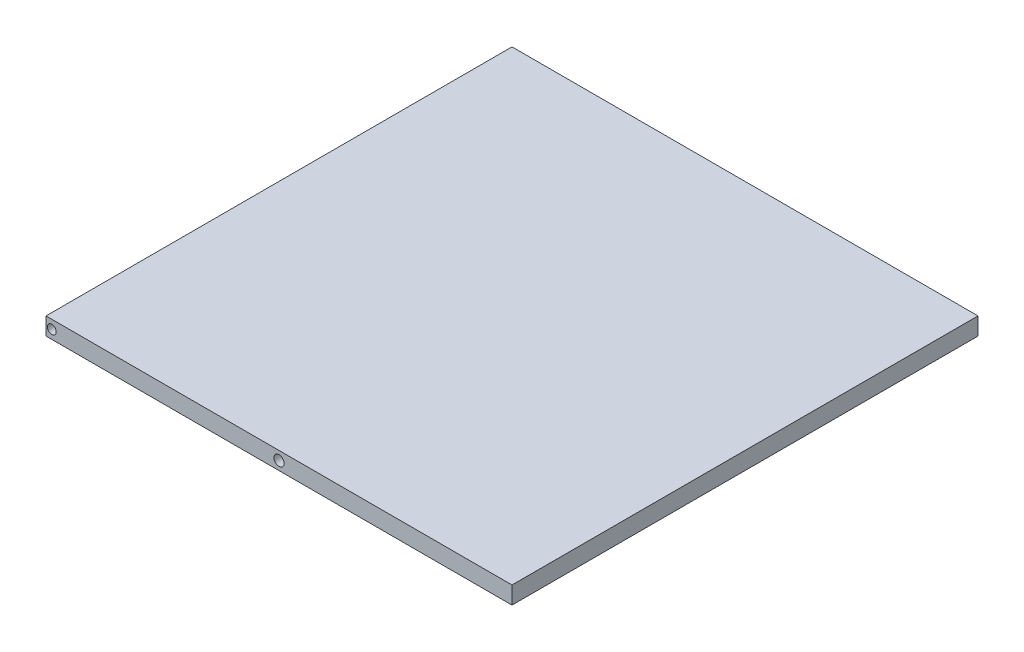
ISO-10303-21;
HEADER;
FILE_DESCRIPTION(('STEP AP214'),'2;1');
FILE_NAME('part.step','',(''),(''),'','','');
FILE_SCHEMA(('AUTOMOTIVE_DESIGN { 1 0 10303 214 1 1 1 1 }'));
ENDSEC;
DATA;
#1=APPLICATION_CONTEXT('core data for automotive mechanical design processes');
#2=APPLICATION_PROTOCOL_DEFINITION('international standard','automotive_design',2000,#1);
#3=PRODUCT_CONTEXT('',#1,'mechanical');
#4=PRODUCT('Part','Part','',(#3));
#5=PRODUCT_RELATED_PRODUCT_CATEGORY('part','',(#4));
#6=PRODUCT_DEFINITION_FORMATION('','',#4);
#7=PRODUCT_DEFINITION_CONTEXT('part definition',#1,'design');
#8=PRODUCT_DEFINITION('design','',#6,#7);
#9=PRODUCT_DEFINITION_SHAPE('','',#8);
#10=(LENGTH_UNIT() NAMED_UNIT(*) SI_UNIT(.MILLI.,.METRE.));
#11=(NAMED_UNIT(*) PLANE_ANGLE_UNIT() SI_UNIT($,.RADIAN.));
#12=(NAMED_UNIT(*) SI_UNIT($,.STERADIAN.) SOLID_ANGLE_UNIT());
#13=UNCERTAINTY_MEASURE_WITH_UNIT(LENGTH_MEASURE(1.E-05),#10,'distance_accuracy_value','');
#14=(GEOMETRIC_REPRESENTATION_CONTEXT(3) GLOBAL_UNCERTAINTY_ASSIGNED_CONTEXT((#13)) GLOBAL_UNIT_ASSIGNED_CONTEXT((#10,
#11,#12)) REPRESENTATION_CONTEXT('',''));
#15=CARTESIAN_POINT('',(0.,0.,0.));
#16=DIRECTION('',(0.,0.,1.));
#17=DIRECTION('',(1.,0.,0.));
#18=AXIS2_PLACEMENT_3D('',#15,#16,#17);
#19=CARTESIAN_POINT('',(0.,19.05,0.));
#20=DIRECTION('',(-1.,0.,0.));
#21=DIRECTION('',(0.,0.,1.));
#22=AXIS2_PLACEMENT_3D('',#19,#20,#21);
#23=PLANE('',#22);
#24=DIRECTION('',(0.,0.,-1.));
#25=VECTOR('',#24,1.);
#26=CARTESIAN_POINT('',(0.,0.,0.));
#27=LINE('',#26,#25);
#28=CARTESIAN_POINT('',(0.,0.,0.));
#29=VERTEX_POINT('',#28);
#30=CARTESIAN_POINT('',(0.,0.,-508.));
#31=VERTEX_POINT('',#30);
#32=EDGE_CURVE('E96',#29,#31,#27,.T.);
#33=ORIENTED_EDGE('',*,*,#32,.T.);
#34=DIRECTION('',(0.,-1.,0.));
#35=VECTOR('',#34,1.);
#36=CARTESIAN_POINT('',(0.,19.05,-508.));
#37=LINE('',#36,#35);
#38=CARTESIAN_POINT('',(0.,19.05,-508.));
#39=VERTEX_POINT('',#38);
#40=EDGE_CURVE('E11',#39,#31,#37,.T.);
#41=ORIENTED_EDGE('',*,*,#40,.F.);
#42=DIRECTION('',(0.,0.,-1.));
#43=VECTOR('',#42,1.);
#44=CARTESIAN_POINT('',(0.,19.05,0.));
#45=LINE('',#44,#43);
#46=CARTESIAN_POINT('',(0.,19.05,0.));
#47=VERTEX_POINT('',#46);
#48=EDGE_CURVE('E82',#47,#39,#45,.T.);
#49=ORIENTED_EDGE('',*,*,#48,.F.);
#50=DIRECTION('',(0.,-1.,0.));
#51=VECTOR('',#50,1.);
#52=CARTESIAN_POINT('',(0.,19.05,0.));
#53=LINE('',#52,#51);
#54=EDGE_CURVE('E49',#47,#29,#53,.T.);
#55=ORIENTED_EDGE('',*,*,#54,.T.);
#56=EDGE_LOOP('',(#33,#41,#49,#55));
#57=FACE_BOUND('',#56,.T.);
#58=ADVANCED_FACE('F33',(#57),#23,.F.);
#59=CARTESIAN_POINT('',(0.,19.05,-508.));
#60=DIRECTION('',(0.,0.,1.));
#61=DIRECTION('',(1.,0.,0.));
#62=AXIS2_PLACEMENT_3D('',#59,#60,#61);
#63=PLANE('',#62);
#64=CARTESIAN_POINT('',(-254.,9.525,-508.));
#65=DIRECTION('',(0.,0.,1.));
#66=DIRECTION('',(1.,0.,0.));
#67=AXIS2_PLACEMENT_3D('',#64,#65,#66);
#68=CIRCLE('',#67,5.52386460643103);
#69=CARTESIAN_POINT('',(-248.476135393569,9.525,-508.));
#70=VERTEX_POINT('',#69);
#71=EDGE_CURVE('E98',#70,#70,#68,.T.);
#72=ORIENTED_EDGE('',*,*,#71,.T.);
#73=EDGE_LOOP('',(#72));
#74=FACE_BOUND('',#73,.T.);
#75=CARTESIAN_POINT('',(-501.65,9.525,-508.));
#76=DIRECTION('',(0.,0.,1.));
#77=DIRECTION('',(1.,0.,0.));
#78=AXIS2_PLACEMENT_3D('',#75,#76,#77);
#79=CIRCLE('',#78,4.82599999999999);
#80=CARTESIAN_POINT('',(-496.824,9.525,-508.));
#81=VERTEX_POINT('',#80);
#82=EDGE_CURVE('E111',#81,#81,#79,.T.);
#83=ORIENTED_EDGE('',*,*,#82,.T.);
#84=EDGE_LOOP('',(#83));
#85=FACE_BOUND('',#84,.T.);
#86=DIRECTION('',(-1.,0.,0.));
#87=VECTOR('',#86,1.);
#88=CARTESIAN_POINT('',(0.,0.,-508.));
#89=LINE('',#88,#87);
#90=CARTESIAN_POINT('',(-508.,0.,-508.));
#91=VERTEX_POINT('',#90);
#92=EDGE_CURVE('E87',#31,#91,#89,.T.);
#93=ORIENTED_EDGE('',*,*,#92,.T.);
#94=DIRECTION('',(0.,-1.,0.));
#95=VECTOR('',#94,1.);
#96=CARTESIAN_POINT('',(-508.,19.05,-508.));
#97=LINE('',#96,#95);
#98=CARTESIAN_POINT('',(-508.,19.05,-508.));
#99=VERTEX_POINT('',#98);
#100=EDGE_CURVE('E41',#99,#91,#97,.T.);
#101=ORIENTED_EDGE('',*,*,#100,.F.);
#102=DIRECTION('',(-1.,0.,0.));
#103=VECTOR('',#102,1.);
#104=CARTESIAN_POINT('',(0.,19.05,-508.));
#105=LINE('',#104,#103);
#106=EDGE_CURVE('E74',#39,#99,#105,.T.);
#107=ORIENTED_EDGE('',*,*,#106,.F.);
#108=ORIENTED_EDGE('',*,*,#40,.T.);
#109=EDGE_LOOP('',(#93,#101,#107,#108));
#110=FACE_BOUND('',#109,.T.);
#111=ADVANCED_FACE('F86',(#74,#85,#110),#63,.F.);
#112=CARTESIAN_POINT('',(-508.,19.05,0.));
#113=DIRECTION('',(-1.,0.,0.));
#114=DIRECTION('',(0.,0.,1.));
#115=AXIS2_PLACEMENT_3D('',#112,#113,#114);
#116=PLANE('',#115);
#117=DIRECTION('',(0.,0.,-1.));
#118=VECTOR('',#117,1.);
#119=CARTESIAN_POINT('',(-508.,0.,0.));
#120=LINE('',#119,#118);
#121=CARTESIAN_POINT('',(-508.,0.,0.));
#122=VERTEX_POINT('',#121);
#123=EDGE_CURVE('E100',#122,#91,#120,.T.);
#124=ORIENTED_EDGE('',*,*,#123,.F.);
#125=DIRECTION('',(0.,-1.,0.));
#126=VECTOR('',#125,1.);
#127=CARTESIAN_POINT('',(-508.,19.05,0.));
#128=LINE('',#127,#126);
#129=CARTESIAN_POINT('',(-508.,19.05,0.));
#130=VERTEX_POINT('',#129);
#131=EDGE_CURVE('E63',#130,#122,#128,.T.);
#132=ORIENTED_EDGE('',*,*,#131,.F.);
#133=DIRECTION('',(0.,0.,-1.));
#134=VECTOR('',#133,1.);
#135=CARTESIAN_POINT('',(-508.,19.05,0.));
#136=LINE('',#135,#134);
#137=EDGE_CURVE('E81',#130,#99,#136,.T.);
#138=ORIENTED_EDGE('',*,*,#137,.T.);
#139=ORIENTED_EDGE('',*,*,#100,.T.);
#140=EDGE_LOOP('',(#124,#132,#138,#139));
#141=FACE_BOUND('',#140,.T.);
#142=ADVANCED_FACE('F90',(#141),#116,.T.);
#143=CARTESIAN_POINT('',(0.,19.05,0.));
#144=DIRECTION('',(0.,0.,1.));
#145=DIRECTION('',(1.,0.,0.));
#146=AXIS2_PLACEMENT_3D('',#143,#144,#145);
#147=PLANE('',#146);
#148=CARTESIAN_POINT('',(-254.,9.525,0.));
#149=DIRECTION('',(0.,0.,1.));
#150=DIRECTION('',(1.,0.,0.));
#151=AXIS2_PLACEMENT_3D('',#148,#149,#150);
#152=CIRCLE('',#151,5.52386460643103);
#153=CARTESIAN_POINT('',(-248.476135393569,9.525,0.));
#154=VERTEX_POINT('',#153);
#155=EDGE_CURVE('E114',#154,#154,#152,.T.);
#156=ORIENTED_EDGE('',*,*,#155,.F.);
#157=EDGE_LOOP('',(#156));
#158=FACE_BOUND('',#157,.T.);
#159=CARTESIAN_POINT('',(-501.65,9.525,0.));
#160=DIRECTION('',(0.,0.,1.));
#161=DIRECTION('',(1.,0.,0.));
#162=AXIS2_PLACEMENT_3D('',#159,#160,#161);
#163=CIRCLE('',#162,4.82599999999999);
#164=CARTESIAN_POINT('',(-496.824,9.525,0.));
#165=VERTEX_POINT('',#164);
#166=EDGE_CURVE('E108',#165,#165,#163,.T.);
#167=ORIENTED_EDGE('',*,*,#166,.F.);
#168=EDGE_LOOP('',(#167));
#169=FACE_BOUND('',#168,.T.);
#170=DIRECTION('',(-1.,0.,0.));
#171=VECTOR('',#170,1.);
#172=CARTESIAN_POINT('',(0.,0.,0.));
#173=LINE('',#172,#171);
#174=EDGE_CURVE('E102',#29,#122,#173,.T.);
#175=ORIENTED_EDGE('',*,*,#174,.F.);
#176=ORIENTED_EDGE('',*,*,#54,.F.);
#177=DIRECTION('',(-1.,0.,0.));
#178=VECTOR('',#177,1.);
#179=CARTESIAN_POINT('',(0.,19.05,0.));
#180=LINE('',#179,#178);
#181=EDGE_CURVE('E91',#47,#130,#180,.T.);
#182=ORIENTED_EDGE('',*,*,#181,.T.);
#183=ORIENTED_EDGE('',*,*,#131,.T.);
#184=EDGE_LOOP('',(#175,#176,#182,#183));
#185=FACE_BOUND('',#184,.T.);
#186=ADVANCED_FACE('F129',(#158,#169,#185),#147,.T.);
#187=CARTESIAN_POINT('',(0.,19.05,0.));
#188=DIRECTION('',(0.,1.,0.));
#189=DIRECTION('',(0.,0.,1.));
#190=AXIS2_PLACEMENT_3D('',#187,#188,#189);
#191=PLANE('',#190);
#192=ORIENTED_EDGE('',*,*,#48,.T.);
#193=ORIENTED_EDGE('',*,*,#106,.T.);
#194=ORIENTED_EDGE('',*,*,#137,.F.);
#195=ORIENTED_EDGE('',*,*,#181,.F.);
#196=EDGE_LOOP('',(#192,#193,#194,#195));
#197=FACE_BOUND('',#196,.T.);
#198=ADVANCED_FACE('F78',(#197),#191,.T.);
#199=CARTESIAN_POINT('',(0.,0.,0.));
#200=DIRECTION('',(0.,1.,0.));
#201=DIRECTION('',(0.,0.,1.));
#202=AXIS2_PLACEMENT_3D('',#199,#200,#201);
#203=PLANE('',#202);
#204=ORIENTED_EDGE('',*,*,#32,.F.);
#205=ORIENTED_EDGE('',*,*,#174,.T.);
#206=ORIENTED_EDGE('',*,*,#123,.T.);
#207=ORIENTED_EDGE('',*,*,#92,.F.);
#208=EDGE_LOOP('',(#204,#205,#206,#207));
#209=FACE_BOUND('',#208,.T.);
#210=ADVANCED_FACE('F136',(#209),#203,.F.);
#211=CARTESIAN_POINT('',(-501.65,9.525,-508.));
#212=DIRECTION('',(0.,0.,1.));
#213=DIRECTION('',(1.,0.,0.));
#214=AXIS2_PLACEMENT_3D('',#211,#212,#213);
#215=CYLINDRICAL_SURFACE('',#214,4.82599999999999);
#216=ORIENTED_EDGE('',*,*,#82,.F.);
#217=EDGE_LOOP('',(#216));
#218=FACE_BOUND('',#217,.T.);
#219=ORIENTED_EDGE('',*,*,#166,.T.);
#220=EDGE_LOOP('',(#219));
#221=FACE_BOUND('',#220,.T.);
#222=ADVANCED_FACE('F125',(#218,#221),#215,.F.);
#223=CARTESIAN_POINT('',(-254.,9.525,-508.));
#224=DIRECTION('',(0.,0.,1.));
#225=DIRECTION('',(1.,0.,0.));
#226=AXIS2_PLACEMENT_3D('',#223,#224,#225);
#227=CYLINDRICAL_SURFACE('',#226,5.52386460643103);
#228=ORIENTED_EDGE('',*,*,#71,.F.);
#229=EDGE_LOOP('',(#228));
#230=FACE_BOUND('',#229,.T.);
#231=ORIENTED_EDGE('',*,*,#155,.T.);
#232=EDGE_LOOP('',(#231));
#233=FACE_BOUND('',#232,.T.);
#234=ADVANCED_FACE('F122',(#230,#233),#227,.F.);
#235=CLOSED_SHELL('',(#58,#111,#142,#186,#198,#210,#222,#234));
#236=MANIFOLD_SOLID_BREP('B2',#235);
#237=ADVANCED_BREP_SHAPE_REPRESENTATION('',(#18,#236),#14);
#238=SHAPE_DEFINITION_REPRESENTATION(#9,#237);
ENDSEC;
END-ISO-10303-21;
